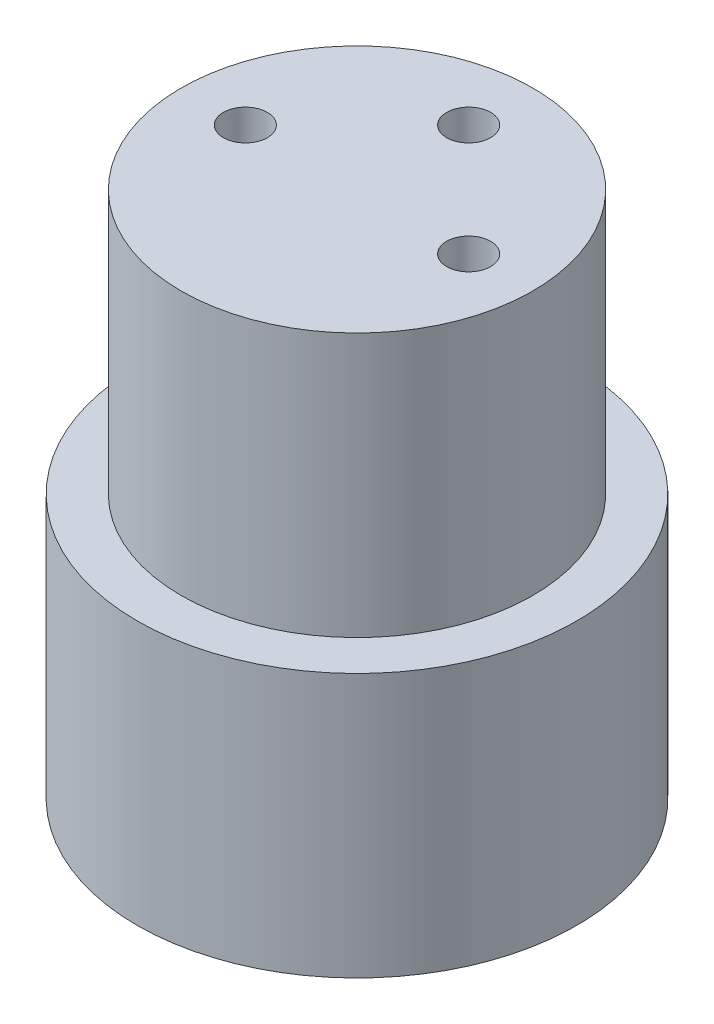
ISO-10303-21;
HEADER;
FILE_DESCRIPTION(('STEP AP214'),'2;1');
FILE_NAME('part.step','',(''),(''),'','','');
FILE_SCHEMA(('AUTOMOTIVE_DESIGN { 1 0 10303 214 1 1 1 1 }'));
ENDSEC;
DATA;
#1=APPLICATION_CONTEXT('core data for automotive mechanical design processes');
#2=APPLICATION_PROTOCOL_DEFINITION('international standard','automotive_design',2000,#1);
#3=PRODUCT_CONTEXT('',#1,'mechanical');
#4=PRODUCT('Part','Part','',(#3));
#5=PRODUCT_RELATED_PRODUCT_CATEGORY('part','',(#4));
#6=PRODUCT_DEFINITION_FORMATION('','',#4);
#7=PRODUCT_DEFINITION_CONTEXT('part definition',#1,'design');
#8=PRODUCT_DEFINITION('design','',#6,#7);
#9=PRODUCT_DEFINITION_SHAPE('','',#8);
#10=(LENGTH_UNIT() NAMED_UNIT(*) SI_UNIT(.MILLI.,.METRE.));
#11=(NAMED_UNIT(*) PLANE_ANGLE_UNIT() SI_UNIT($,.RADIAN.));
#12=(NAMED_UNIT(*) SI_UNIT($,.STERADIAN.) SOLID_ANGLE_UNIT());
#13=UNCERTAINTY_MEASURE_WITH_UNIT(LENGTH_MEASURE(1.E-05),#10,'distance_accuracy_value','');
#14=(GEOMETRIC_REPRESENTATION_CONTEXT(3) GLOBAL_UNCERTAINTY_ASSIGNED_CONTEXT((#13)) GLOBAL_UNIT_ASSIGNED_CONTEXT((#10,
#11,#12)) REPRESENTATION_CONTEXT('',''));
#15=CARTESIAN_POINT('',(0.,0.,0.));
#16=DIRECTION('',(0.,0.,1.));
#17=DIRECTION('',(1.,0.,0.));
#18=AXIS2_PLACEMENT_3D('',#15,#16,#17);
#19=CARTESIAN_POINT('',(0.,3.,0.));
#20=DIRECTION('',(0.,-1.,0.));
#21=DIRECTION('',(0.,0.,-1.));
#22=AXIS2_PLACEMENT_3D('',#19,#20,#21);
#23=CYLINDRICAL_SURFACE('',#22,2.5);
#24=CARTESIAN_POINT('',(0.,3.,0.));
#25=DIRECTION('',(0.,1.,0.));
#26=DIRECTION('',(0.,0.,1.));
#27=AXIS2_PLACEMENT_3D('',#24,#25,#26);
#28=CIRCLE('',#27,2.5);
#29=CARTESIAN_POINT('',(0.,3.,2.5));
#30=VERTEX_POINT('',#29);
#31=EDGE_CURVE('E40',#30,#30,#28,.T.);
#32=ORIENTED_EDGE('',*,*,#31,.F.);
#33=EDGE_LOOP('',(#32));
#34=FACE_BOUND('',#33,.T.);
#35=CARTESIAN_POINT('',(0.,0.,0.));
#36=DIRECTION('',(0.,1.,0.));
#37=DIRECTION('',(0.,0.,1.));
#38=AXIS2_PLACEMENT_3D('',#35,#36,#37);
#39=CIRCLE('',#38,2.5);
#40=CARTESIAN_POINT('',(0.,0.,2.5));
#41=VERTEX_POINT('',#40);
#42=EDGE_CURVE('E45',#41,#41,#39,.T.);
#43=ORIENTED_EDGE('',*,*,#42,.T.);
#44=EDGE_LOOP('',(#43));
#45=FACE_BOUND('',#44,.T.);
#46=ADVANCED_FACE('F33',(#34,#45),#23,.T.);
#47=CARTESIAN_POINT('',(0.,3.,0.));
#48=DIRECTION('',(0.,1.,0.));
#49=DIRECTION('',(0.,0.,1.));
#50=AXIS2_PLACEMENT_3D('',#47,#48,#49);
#51=PLANE('',#50);
#52=CARTESIAN_POINT('',(0.,3.,0.));
#53=DIRECTION('',(0.,1.,0.));
#54=DIRECTION('',(0.,0.,1.));
#55=AXIS2_PLACEMENT_3D('',#52,#53,#54);
#56=CIRCLE('',#55,2.);
#57=CARTESIAN_POINT('',(0.,3.,2.));
#58=VERTEX_POINT('',#57);
#59=EDGE_CURVE('E10',#58,#58,#56,.T.);
#60=ORIENTED_EDGE('',*,*,#59,.F.);
#61=EDGE_LOOP('',(#60));
#62=FACE_BOUND('',#61,.T.);
#63=ORIENTED_EDGE('',*,*,#31,.T.);
#64=EDGE_LOOP('',(#63));
#65=FACE_BOUND('',#64,.T.);
#66=ADVANCED_FACE('F79',(#62,#65),#51,.T.);
#67=CARTESIAN_POINT('',(0.,0.,0.));
#68=DIRECTION('',(0.,1.,0.));
#69=DIRECTION('',(0.,0.,1.));
#70=AXIS2_PLACEMENT_3D('',#67,#68,#69);
#71=PLANE('',#70);
#72=CARTESIAN_POINT('',(0.,0.,-1.27));
#73=DIRECTION('',(0.,-1.,0.));
#74=DIRECTION('',(0.,0.,-1.));
#75=AXIS2_PLACEMENT_3D('',#72,#73,#74);
#76=CIRCLE('',#75,0.25);
#77=CARTESIAN_POINT('',(0.,0.,-1.52));
#78=VERTEX_POINT('',#77);
#79=EDGE_CURVE('E56',#78,#78,#76,.T.);
#80=ORIENTED_EDGE('',*,*,#79,.F.);
#81=EDGE_LOOP('',(#80));
#82=FACE_BOUND('',#81,.T.);
#83=CARTESIAN_POINT('',(1.27,0.,0.));
#84=DIRECTION('',(0.,-1.,0.));
#85=DIRECTION('',(0.,0.,-1.));
#86=AXIS2_PLACEMENT_3D('',#83,#84,#85);
#87=CIRCLE('',#86,0.25);
#88=CARTESIAN_POINT('',(1.27,0.,-0.25));
#89=VERTEX_POINT('',#88);
#90=EDGE_CURVE('E141',#89,#89,#87,.T.);
#91=ORIENTED_EDGE('',*,*,#90,.F.);
#92=EDGE_LOOP('',(#91));
#93=FACE_BOUND('',#92,.T.);
#94=CARTESIAN_POINT('',(-1.27,0.,0.));
#95=DIRECTION('',(0.,-1.,0.));
#96=DIRECTION('',(0.,0.,-1.));
#97=AXIS2_PLACEMENT_3D('',#94,#95,#96);
#98=CIRCLE('',#97,0.25);
#99=CARTESIAN_POINT('',(-1.27,0.,-0.25));
#100=VERTEX_POINT('',#99);
#101=EDGE_CURVE('E144',#100,#100,#98,.T.);
#102=ORIENTED_EDGE('',*,*,#101,.F.);
#103=EDGE_LOOP('',(#102));
#104=FACE_BOUND('',#103,.T.);
#105=ORIENTED_EDGE('',*,*,#42,.F.);
#106=EDGE_LOOP('',(#105));
#107=FACE_BOUND('',#106,.T.);
#108=ADVANCED_FACE('F70',(#82,#93,#104,#107),#71,.F.);
#109=CARTESIAN_POINT('',(0.,6.,0.));
#110=DIRECTION('',(0.,-1.,0.));
#111=DIRECTION('',(0.,0.,-1.));
#112=AXIS2_PLACEMENT_3D('',#109,#110,#111);
#113=CYLINDRICAL_SURFACE('',#112,2.);
#114=CARTESIAN_POINT('',(0.,6.,0.));
#115=DIRECTION('',(0.,1.,0.));
#116=DIRECTION('',(0.,0.,1.));
#117=AXIS2_PLACEMENT_3D('',#114,#115,#116);
#118=CIRCLE('',#117,2.);
#119=CARTESIAN_POINT('',(0.,6.,2.));
#120=VERTEX_POINT('',#119);
#121=EDGE_CURVE('E48',#120,#120,#118,.T.);
#122=ORIENTED_EDGE('',*,*,#121,.F.);
#123=EDGE_LOOP('',(#122));
#124=FACE_BOUND('',#123,.T.);
#125=ORIENTED_EDGE('',*,*,#59,.T.);
#126=EDGE_LOOP('',(#125));
#127=FACE_BOUND('',#126,.T.);
#128=ADVANCED_FACE('F68',(#124,#127),#113,.T.);
#129=CARTESIAN_POINT('',(0.,6.,0.));
#130=DIRECTION('',(0.,1.,0.));
#131=DIRECTION('',(0.,0.,1.));
#132=AXIS2_PLACEMENT_3D('',#129,#130,#131);
#133=PLANE('',#132);
#134=CARTESIAN_POINT('',(0.,6.,-1.27));
#135=DIRECTION('',(0.,1.,0.));
#136=DIRECTION('',(0.,0.,1.));
#137=AXIS2_PLACEMENT_3D('',#134,#135,#136);
#138=CIRCLE('',#137,0.25);
#139=CARTESIAN_POINT('',(0.,6.,-1.02));
#140=VERTEX_POINT('',#139);
#141=EDGE_CURVE('E36',#140,#140,#138,.T.);
#142=ORIENTED_EDGE('',*,*,#141,.F.);
#143=EDGE_LOOP('',(#142));
#144=FACE_BOUND('',#143,.T.);
#145=CARTESIAN_POINT('',(1.27,6.,0.));
#146=DIRECTION('',(0.,1.,0.));
#147=DIRECTION('',(0.,0.,1.));
#148=AXIS2_PLACEMENT_3D('',#145,#146,#147);
#149=CIRCLE('',#148,0.25);
#150=CARTESIAN_POINT('',(1.27,6.,0.25));
#151=VERTEX_POINT('',#150);
#152=EDGE_CURVE('E55',#151,#151,#149,.T.);
#153=ORIENTED_EDGE('',*,*,#152,.F.);
#154=EDGE_LOOP('',(#153));
#155=FACE_BOUND('',#154,.T.);
#156=CARTESIAN_POINT('',(-1.27,6.,0.));
#157=DIRECTION('',(0.,1.,0.));
#158=DIRECTION('',(0.,0.,1.));
#159=AXIS2_PLACEMENT_3D('',#156,#157,#158);
#160=CIRCLE('',#159,0.25);
#161=CARTESIAN_POINT('',(-1.27,6.,0.25));
#162=VERTEX_POINT('',#161);
#163=EDGE_CURVE('E53',#162,#162,#160,.T.);
#164=ORIENTED_EDGE('',*,*,#163,.F.);
#165=EDGE_LOOP('',(#164));
#166=FACE_BOUND('',#165,.T.);
#167=ORIENTED_EDGE('',*,*,#121,.T.);
#168=EDGE_LOOP('',(#167));
#169=FACE_BOUND('',#168,.T.);
#170=ADVANCED_FACE('F66',(#144,#155,#166,#169),#133,.T.);
#171=CARTESIAN_POINT('',(-1.27,10.,0.));
#172=DIRECTION('',(0.,-1.,0.));
#173=DIRECTION('',(0.,0.,-1.));
#174=AXIS2_PLACEMENT_3D('',#171,#172,#173);
#175=CYLINDRICAL_SURFACE('',#174,0.25);
#176=ORIENTED_EDGE('',*,*,#163,.T.);
#177=EDGE_LOOP('',(#176));
#178=FACE_BOUND('',#177,.T.);
#179=ORIENTED_EDGE('',*,*,#101,.T.);
#180=EDGE_LOOP('',(#179));
#181=FACE_BOUND('',#180,.T.);
#182=ADVANCED_FACE('F76',(#178,#181),#175,.F.);
#183=CARTESIAN_POINT('',(1.27,10.,0.));
#184=DIRECTION('',(0.,-1.,0.));
#185=DIRECTION('',(0.,0.,-1.));
#186=AXIS2_PLACEMENT_3D('',#183,#184,#185);
#187=CYLINDRICAL_SURFACE('',#186,0.25);
#188=ORIENTED_EDGE('',*,*,#152,.T.);
#189=EDGE_LOOP('',(#188));
#190=FACE_BOUND('',#189,.T.);
#191=ORIENTED_EDGE('',*,*,#90,.T.);
#192=EDGE_LOOP('',(#191));
#193=FACE_BOUND('',#192,.T.);
#194=ADVANCED_FACE('F116',(#190,#193),#187,.F.);
#195=CARTESIAN_POINT('',(0.,10.,-1.27));
#196=DIRECTION('',(0.,-1.,0.));
#197=DIRECTION('',(0.,0.,-1.));
#198=AXIS2_PLACEMENT_3D('',#195,#196,#197);
#199=CYLINDRICAL_SURFACE('',#198,0.25);
#200=ORIENTED_EDGE('',*,*,#141,.T.);
#201=EDGE_LOOP('',(#200));
#202=FACE_BOUND('',#201,.T.);
#203=ORIENTED_EDGE('',*,*,#79,.T.);
#204=EDGE_LOOP('',(#203));
#205=FACE_BOUND('',#204,.T.);
#206=ADVANCED_FACE('F126',(#202,#205),#199,.F.);
#207=CLOSED_SHELL('',(#46,#66,#108,#128,#170,#182,#194,#206));
#208=MANIFOLD_SOLID_BREP('B2',#207);
#209=ADVANCED_BREP_SHAPE_REPRESENTATION('',(#18,#208),#14);
#210=SHAPE_DEFINITION_REPRESENTATION(#9,#209);
ENDSEC;
END-ISO-10303-21;
